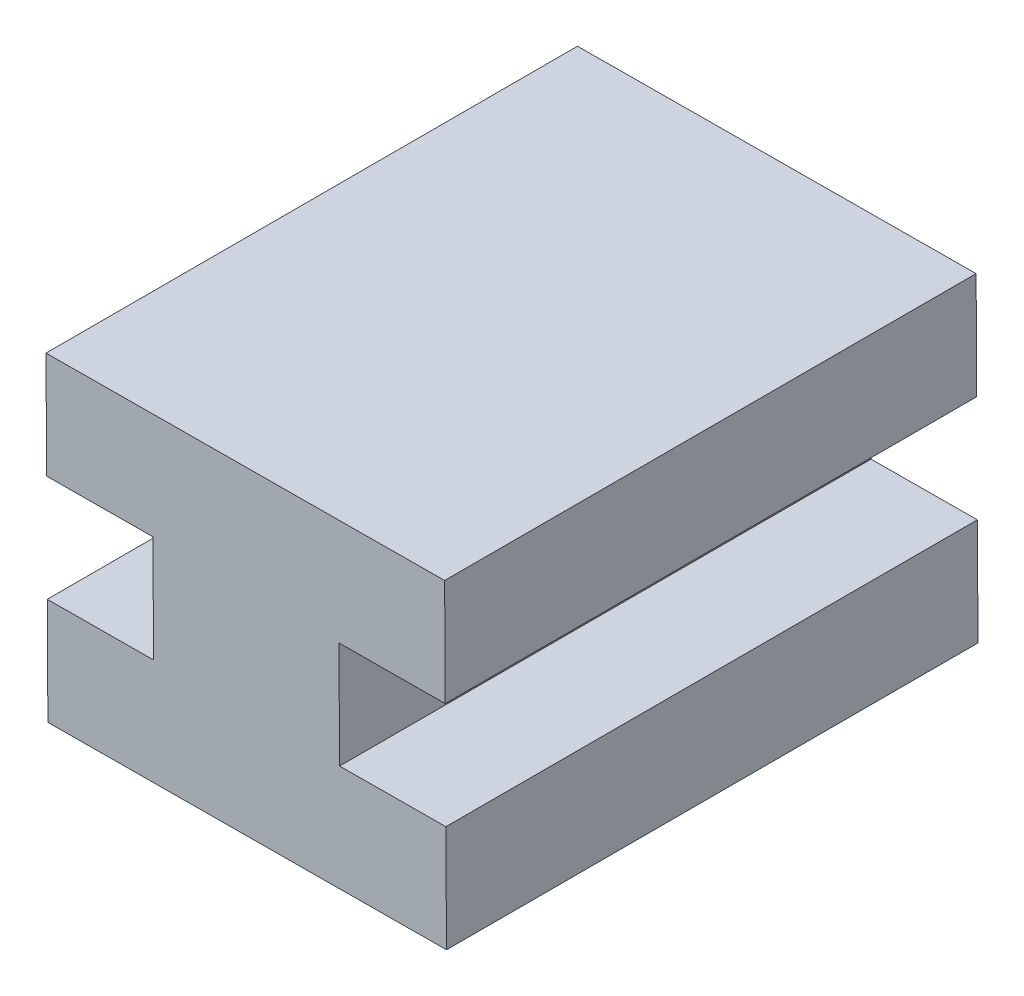
ISO-10303-21;
HEADER;
FILE_DESCRIPTION(('STEP AP214'),'2;1');
FILE_NAME('part.step','',(''),(''),'','','');
FILE_SCHEMA(('AUTOMOTIVE_DESIGN { 1 0 10303 214 1 1 1 1 }'));
ENDSEC;
DATA;
#1=APPLICATION_CONTEXT('core data for automotive mechanical design processes');
#2=APPLICATION_PROTOCOL_DEFINITION('international standard','automotive_design',2000,#1);
#3=PRODUCT_CONTEXT('',#1,'mechanical');
#4=PRODUCT('Part','Part','',(#3));
#5=PRODUCT_RELATED_PRODUCT_CATEGORY('part','',(#4));
#6=PRODUCT_DEFINITION_FORMATION('','',#4);
#7=PRODUCT_DEFINITION_CONTEXT('part definition',#1,'design');
#8=PRODUCT_DEFINITION('design','',#6,#7);
#9=PRODUCT_DEFINITION_SHAPE('','',#8);
#10=(LENGTH_UNIT() NAMED_UNIT(*) SI_UNIT(.MILLI.,.METRE.));
#11=(NAMED_UNIT(*) PLANE_ANGLE_UNIT() SI_UNIT($,.RADIAN.));
#12=(NAMED_UNIT(*) SI_UNIT($,.STERADIAN.) SOLID_ANGLE_UNIT());
#13=UNCERTAINTY_MEASURE_WITH_UNIT(LENGTH_MEASURE(1.E-05),#10,'distance_accuracy_value','');
#14=(GEOMETRIC_REPRESENTATION_CONTEXT(3) GLOBAL_UNCERTAINTY_ASSIGNED_CONTEXT((#13)) GLOBAL_UNIT_ASSIGNED_CONTEXT((#10,
#11,#12)) REPRESENTATION_CONTEXT('',''));
#15=CARTESIAN_POINT('',(0.,0.,0.));
#16=DIRECTION('',(0.,0.,1.));
#17=DIRECTION('',(1.,0.,0.));
#18=AXIS2_PLACEMENT_3D('',#15,#16,#17);
#19=CARTESIAN_POINT('',(7.25087420634283,129.455799301792,-10.));
#20=DIRECTION('',(-0.999982523573569,-0.00591206794918995,0.));
#21=DIRECTION('',(0.00591206794918995,-0.999982523573569,0.));
#22=AXIS2_PLACEMENT_3D('',#19,#20,#21);
#23=PLANE('',#22);
#24=DIRECTION('',(0.,0.,1.));
#25=VECTOR('',#24,1.);
#26=CARTESIAN_POINT('',(7.27452247813959,125.455869207498,-10.));
#27=LINE('',#26,#25);
#28=CARTESIAN_POINT('',(7.27452247813959,125.455869207498,-10.));
#29=VERTEX_POINT('',#28);
#30=CARTESIAN_POINT('',(7.27452247813959,125.455869207498,10.));
#31=VERTEX_POINT('',#30);
#32=EDGE_CURVE('E35',#29,#31,#27,.T.);
#33=ORIENTED_EDGE('',*,*,#32,.T.);
#34=DIRECTION('',(0.00591206794918995,-0.999982523573569,0.));
#35=VECTOR('',#34,1.);
#36=CARTESIAN_POINT('',(7.25087420634283,129.455799301792,10.));
#37=LINE('',#36,#35);
#38=CARTESIAN_POINT('',(7.25087420634283,129.455799301792,10.));
#39=VERTEX_POINT('',#38);
#40=EDGE_CURVE('E120',#39,#31,#37,.T.);
#41=ORIENTED_EDGE('',*,*,#40,.F.);
#42=DIRECTION('',(0.,0.,1.));
#43=VECTOR('',#42,1.);
#44=CARTESIAN_POINT('',(7.25087420634283,129.455799301792,-10.));
#45=LINE('',#44,#43);
#46=CARTESIAN_POINT('',(7.25087420634283,129.455799301792,-10.));
#47=VERTEX_POINT('',#46);
#48=EDGE_CURVE('E11',#47,#39,#45,.T.);
#49=ORIENTED_EDGE('',*,*,#48,.F.);
#50=DIRECTION('',(0.00591206794918995,-0.999982523573569,0.));
#51=VECTOR('',#50,1.);
#52=CARTESIAN_POINT('',(7.25087420634283,129.455799301792,-10.));
#53=LINE('',#52,#51);
#54=EDGE_CURVE('E121',#47,#29,#53,.T.);
#55=ORIENTED_EDGE('',*,*,#54,.T.);
#56=EDGE_LOOP('',(#33,#41,#49,#55));
#57=FACE_BOUND('',#56,.T.);
#58=ADVANCED_FACE('F32',(#57),#23,.T.);
#59=CARTESIAN_POINT('',(11.2508043006371,129.479447573589,-10.));
#60=DIRECTION('',(-0.00591206794919863,0.999982523573569,0.));
#61=DIRECTION('',(-0.999982523573569,-0.00591206794919863,0.));
#62=AXIS2_PLACEMENT_3D('',#59,#60,#61);
#63=PLANE('',#62);
#64=ORIENTED_EDGE('',*,*,#48,.T.);
#65=DIRECTION('',(-0.999982523573569,-0.00591206794919863,0.));
#66=VECTOR('',#65,1.);
#67=CARTESIAN_POINT('',(11.2508043006371,129.479447573589,10.));
#68=LINE('',#67,#66);
#69=CARTESIAN_POINT('',(11.2508043006371,129.479447573589,10.));
#70=VERTEX_POINT('',#69);
#71=EDGE_CURVE('E138',#70,#39,#68,.T.);
#72=ORIENTED_EDGE('',*,*,#71,.F.);
#73=DIRECTION('',(0.,0.,1.));
#74=VECTOR('',#73,1.);
#75=CARTESIAN_POINT('',(11.2508043006371,129.479447573589,-10.));
#76=LINE('',#75,#74);
#77=CARTESIAN_POINT('',(11.2508043006371,129.479447573589,-10.));
#78=VERTEX_POINT('',#77);
#79=EDGE_CURVE('E40',#78,#70,#76,.T.);
#80=ORIENTED_EDGE('',*,*,#79,.F.);
#81=DIRECTION('',(-0.999982523573569,-0.00591206794919863,0.));
#82=VECTOR('',#81,1.);
#83=CARTESIAN_POINT('',(11.2508043006371,129.479447573589,-10.));
#84=LINE('',#83,#82);
#85=EDGE_CURVE('E126',#78,#47,#84,.T.);
#86=ORIENTED_EDGE('',*,*,#85,.T.);
#87=EDGE_LOOP('',(#64,#72,#80,#86));
#88=FACE_BOUND('',#87,.T.);
#89=ADVANCED_FACE('F250',(#88),#63,.T.);
#90=CARTESIAN_POINT('',(11.2271560288403,133.479377667884,-10.));
#91=DIRECTION('',(-0.999982523573569,-0.00591206794919429,0.));
#92=DIRECTION('',(0.00591206794919429,-0.999982523573569,0.));
#93=AXIS2_PLACEMENT_3D('',#90,#91,#92);
#94=PLANE('',#93);
#95=ORIENTED_EDGE('',*,*,#79,.T.);
#96=DIRECTION('',(0.00591206794919429,-0.999982523573569,0.));
#97=VECTOR('',#96,1.);
#98=CARTESIAN_POINT('',(11.2271560288403,133.479377667884,10.));
#99=LINE('',#98,#97);
#100=CARTESIAN_POINT('',(11.2271560288403,133.479377667884,10.));
#101=VERTEX_POINT('',#100);
#102=EDGE_CURVE('E163',#101,#70,#99,.T.);
#103=ORIENTED_EDGE('',*,*,#102,.F.);
#104=DIRECTION('',(0.,0.,1.));
#105=VECTOR('',#104,1.);
#106=CARTESIAN_POINT('',(11.2271560288403,133.479377667884,-10.));
#107=LINE('',#106,#105);
#108=CARTESIAN_POINT('',(11.2271560288403,133.479377667884,-10.));
#109=VERTEX_POINT('',#108);
#110=EDGE_CURVE('E197',#109,#101,#107,.T.);
#111=ORIENTED_EDGE('',*,*,#110,.F.);
#112=DIRECTION('',(0.00591206794919429,-0.999982523573569,0.));
#113=VECTOR('',#112,1.);
#114=CARTESIAN_POINT('',(11.2271560288403,133.479377667884,-10.));
#115=LINE('',#114,#113);
#116=EDGE_CURVE('E193',#109,#78,#115,.T.);
#117=ORIENTED_EDGE('',*,*,#116,.T.);
#118=EDGE_LOOP('',(#95,#103,#111,#117));
#119=FACE_BOUND('',#118,.T.);
#120=ADVANCED_FACE('F248',(#119),#94,.T.);
#121=CARTESIAN_POINT('',(7.22722593454606,133.455729396087,-10.));
#122=DIRECTION('',(0.00591206794919863,-0.999982523573569,0.));
#123=DIRECTION('',(0.999982523573569,0.00591206794919863,0.));
#124=AXIS2_PLACEMENT_3D('',#121,#122,#123);
#125=PLANE('',#124);
#126=ORIENTED_EDGE('',*,*,#110,.T.);
#127=DIRECTION('',(0.999982523573569,0.00591206794919863,0.));
#128=VECTOR('',#127,1.);
#129=CARTESIAN_POINT('',(7.22722593454606,133.455729396087,10.));
#130=LINE('',#129,#128);
#131=CARTESIAN_POINT('',(7.22722593454606,133.455729396087,10.));
#132=VERTEX_POINT('',#131);
#133=EDGE_CURVE('E160',#132,#101,#130,.T.);
#134=ORIENTED_EDGE('',*,*,#133,.F.);
#135=DIRECTION('',(0.,0.,1.));
#136=VECTOR('',#135,1.);
#137=CARTESIAN_POINT('',(7.22722593454606,133.455729396087,-10.));
#138=LINE('',#137,#136);
#139=CARTESIAN_POINT('',(7.22722593454606,133.455729396087,-10.));
#140=VERTEX_POINT('',#139);
#141=EDGE_CURVE('E199',#140,#132,#138,.T.);
#142=ORIENTED_EDGE('',*,*,#141,.F.);
#143=DIRECTION('',(0.999982523573569,0.00591206794919863,0.));
#144=VECTOR('',#143,1.);
#145=CARTESIAN_POINT('',(7.22722593454606,133.455729396087,-10.));
#146=LINE('',#145,#144);
#147=EDGE_CURVE('E190',#140,#109,#146,.T.);
#148=ORIENTED_EDGE('',*,*,#147,.T.);
#149=EDGE_LOOP('',(#126,#134,#142,#148));
#150=FACE_BOUND('',#149,.T.);
#151=ADVANCED_FACE('F246',(#150),#125,.T.);
#152=CARTESIAN_POINT('',(7.20357766274929,137.455659490381,-10.));
#153=DIRECTION('',(-0.999982523573569,-0.00591206794919255,0.));
#154=DIRECTION('',(0.00591206794919255,-0.999982523573569,0.));
#155=AXIS2_PLACEMENT_3D('',#152,#153,#154);
#156=PLANE('',#155);
#157=ORIENTED_EDGE('',*,*,#141,.T.);
#158=DIRECTION('',(0.00591206794919256,-0.999982523573569,0.));
#159=VECTOR('',#158,1.);
#160=CARTESIAN_POINT('',(7.20357766274929,137.455659490381,10.));
#161=LINE('',#160,#159);
#162=CARTESIAN_POINT('',(7.20357766274929,137.455659490381,10.));
#163=VERTEX_POINT('',#162);
#164=EDGE_CURVE('E157',#163,#132,#161,.T.);
#165=ORIENTED_EDGE('',*,*,#164,.F.);
#166=DIRECTION('',(0.,0.,1.));
#167=VECTOR('',#166,1.);
#168=CARTESIAN_POINT('',(7.20357766274929,137.455659490381,-10.));
#169=LINE('',#168,#167);
#170=CARTESIAN_POINT('',(7.20357766274929,137.455659490381,-10.));
#171=VERTEX_POINT('',#170);
#172=EDGE_CURVE('E201',#171,#163,#169,.T.);
#173=ORIENTED_EDGE('',*,*,#172,.F.);
#174=DIRECTION('',(0.00591206794919256,-0.999982523573569,0.));
#175=VECTOR('',#174,1.);
#176=CARTESIAN_POINT('',(7.20357766274929,137.455659490381,-10.));
#177=LINE('',#176,#175);
#178=EDGE_CURVE('E187',#171,#140,#177,.T.);
#179=ORIENTED_EDGE('',*,*,#178,.T.);
#180=EDGE_LOOP('',(#157,#165,#173,#179));
#181=FACE_BOUND('',#180,.T.);
#182=ADVANCED_FACE('F241',(#181),#156,.T.);
#183=CARTESIAN_POINT('',(22.2033155163528,137.544340509619,-10.));
#184=DIRECTION('',(-0.00591206794919308,0.999982523573569,0.));
#185=DIRECTION('',(-0.999982523573569,-0.00591206794919308,0.));
#186=AXIS2_PLACEMENT_3D('',#183,#184,#185);
#187=PLANE('',#186);
#188=ORIENTED_EDGE('',*,*,#172,.T.);
#189=DIRECTION('',(-0.999982523573569,-0.00591206794919308,0.));
#190=VECTOR('',#189,1.);
#191=CARTESIAN_POINT('',(22.2033155163528,137.544340509619,10.));
#192=LINE('',#191,#190);
#193=CARTESIAN_POINT('',(22.2033155163528,137.544340509619,10.));
#194=VERTEX_POINT('',#193);
#195=EDGE_CURVE('E154',#194,#163,#192,.T.);
#196=ORIENTED_EDGE('',*,*,#195,.F.);
#197=DIRECTION('',(0.,0.,1.));
#198=VECTOR('',#197,1.);
#199=CARTESIAN_POINT('',(22.2033155163528,137.544340509619,-10.));
#200=LINE('',#199,#198);
#201=CARTESIAN_POINT('',(22.2033155163528,137.544340509619,-10.));
#202=VERTEX_POINT('',#201);
#203=EDGE_CURVE('E203',#202,#194,#200,.T.);
#204=ORIENTED_EDGE('',*,*,#203,.F.);
#205=DIRECTION('',(-0.999982523573569,-0.00591206794919308,0.));
#206=VECTOR('',#205,1.);
#207=CARTESIAN_POINT('',(22.2033155163528,137.544340509619,-10.));
#208=LINE('',#207,#206);
#209=EDGE_CURVE('E184',#202,#171,#208,.T.);
#210=ORIENTED_EDGE('',*,*,#209,.T.);
#211=EDGE_LOOP('',(#188,#196,#204,#210));
#212=FACE_BOUND('',#211,.T.);
#213=ADVANCED_FACE('F236',(#212),#187,.T.);
#214=CARTESIAN_POINT('',(22.2269637881496,133.544410415325,-10.));
#215=DIRECTION('',(0.999982523573569,0.00591206794919169,0.));
#216=DIRECTION('',(-0.00591206794919169,0.999982523573569,0.));
#217=AXIS2_PLACEMENT_3D('',#214,#215,#216);
#218=PLANE('',#217);
#219=ORIENTED_EDGE('',*,*,#203,.T.);
#220=DIRECTION('',(-0.00591206794919169,0.999982523573569,0.));
#221=VECTOR('',#220,1.);
#222=CARTESIAN_POINT('',(22.2269637881496,133.544410415325,10.));
#223=LINE('',#222,#221);
#224=CARTESIAN_POINT('',(22.2269637881496,133.544410415325,10.));
#225=VERTEX_POINT('',#224);
#226=EDGE_CURVE('E151',#225,#194,#223,.T.);
#227=ORIENTED_EDGE('',*,*,#226,.F.);
#228=DIRECTION('',(0.,0.,1.));
#229=VECTOR('',#228,1.);
#230=CARTESIAN_POINT('',(22.2269637881496,133.544410415325,-10.));
#231=LINE('',#230,#229);
#232=CARTESIAN_POINT('',(22.2269637881496,133.544410415325,-10.));
#233=VERTEX_POINT('',#232);
#234=EDGE_CURVE('E205',#233,#225,#231,.T.);
#235=ORIENTED_EDGE('',*,*,#234,.F.);
#236=DIRECTION('',(-0.00591206794919169,0.999982523573569,0.));
#237=VECTOR('',#236,1.);
#238=CARTESIAN_POINT('',(22.2269637881496,133.544410415325,-10.));
#239=LINE('',#238,#237);
#240=EDGE_CURVE('E181',#233,#202,#239,.T.);
#241=ORIENTED_EDGE('',*,*,#240,.T.);
#242=EDGE_LOOP('',(#219,#227,#235,#241));
#243=FACE_BOUND('',#242,.T.);
#244=ADVANCED_FACE('F234',(#243),#218,.T.);
#245=CARTESIAN_POINT('',(18.2270336938553,133.520762143528,-10.));
#246=DIRECTION('',(0.00591206794919169,-0.999982523573569,0.));
#247=DIRECTION('',(0.999982523573569,0.00591206794919169,0.));
#248=AXIS2_PLACEMENT_3D('',#245,#246,#247);
#249=PLANE('',#248);
#250=ORIENTED_EDGE('',*,*,#234,.T.);
#251=DIRECTION('',(0.999982523573569,0.00591206794919169,0.));
#252=VECTOR('',#251,1.);
#253=CARTESIAN_POINT('',(18.2270336938553,133.520762143528,10.));
#254=LINE('',#253,#252);
#255=CARTESIAN_POINT('',(18.2270336938553,133.520762143528,10.));
#256=VERTEX_POINT('',#255);
#257=EDGE_CURVE('E148',#256,#225,#254,.T.);
#258=ORIENTED_EDGE('',*,*,#257,.F.);
#259=DIRECTION('',(0.,0.,1.));
#260=VECTOR('',#259,1.);
#261=CARTESIAN_POINT('',(18.2270336938553,133.520762143528,-10.));
#262=LINE('',#261,#260);
#263=CARTESIAN_POINT('',(18.2270336938553,133.520762143528,-10.));
#264=VERTEX_POINT('',#263);
#265=EDGE_CURVE('E207',#264,#256,#262,.T.);
#266=ORIENTED_EDGE('',*,*,#265,.F.);
#267=DIRECTION('',(0.999982523573569,0.00591206794919169,0.));
#268=VECTOR('',#267,1.);
#269=CARTESIAN_POINT('',(18.2270336938553,133.520762143528,-10.));
#270=LINE('',#269,#268);
#271=EDGE_CURVE('E178',#264,#233,#270,.T.);
#272=ORIENTED_EDGE('',*,*,#271,.T.);
#273=EDGE_LOOP('',(#250,#258,#266,#272));
#274=FACE_BOUND('',#273,.T.);
#275=ADVANCED_FACE('F229',(#274),#249,.T.);
#276=CARTESIAN_POINT('',(18.2506819656521,129.520832049234,-10.));
#277=DIRECTION('',(0.999982523573569,0.00591206794919169,0.));
#278=DIRECTION('',(-0.00591206794919169,0.999982523573569,0.));
#279=AXIS2_PLACEMENT_3D('',#276,#277,#278);
#280=PLANE('',#279);
#281=ORIENTED_EDGE('',*,*,#265,.T.);
#282=DIRECTION('',(-0.00591206794919169,0.999982523573569,0.));
#283=VECTOR('',#282,1.);
#284=CARTESIAN_POINT('',(18.2506819656521,129.520832049234,10.));
#285=LINE('',#284,#283);
#286=CARTESIAN_POINT('',(18.2506819656521,129.520832049234,10.));
#287=VERTEX_POINT('',#286);
#288=EDGE_CURVE('E145',#287,#256,#285,.T.);
#289=ORIENTED_EDGE('',*,*,#288,.F.);
#290=DIRECTION('',(0.,0.,1.));
#291=VECTOR('',#290,1.);
#292=CARTESIAN_POINT('',(18.2506819656521,129.520832049234,-10.));
#293=LINE('',#292,#291);
#294=CARTESIAN_POINT('',(18.2506819656521,129.520832049234,-10.));
#295=VERTEX_POINT('',#294);
#296=EDGE_CURVE('E209',#295,#287,#293,.T.);
#297=ORIENTED_EDGE('',*,*,#296,.F.);
#298=DIRECTION('',(-0.00591206794919169,0.999982523573569,0.));
#299=VECTOR('',#298,1.);
#300=CARTESIAN_POINT('',(18.2506819656521,129.520832049234,-10.));
#301=LINE('',#300,#299);
#302=EDGE_CURVE('E175',#295,#264,#301,.T.);
#303=ORIENTED_EDGE('',*,*,#302,.T.);
#304=EDGE_LOOP('',(#281,#289,#297,#303));
#305=FACE_BOUND('',#304,.T.);
#306=ADVANCED_FACE('F222',(#305),#280,.T.);
#307=CARTESIAN_POINT('',(22.2506120599464,129.54448032103,-10.));
#308=DIRECTION('',(-0.00591206794919169,0.999982523573569,0.));
#309=DIRECTION('',(-0.999982523573569,-0.00591206794919169,0.));
#310=AXIS2_PLACEMENT_3D('',#307,#308,#309);
#311=PLANE('',#310);
#312=ORIENTED_EDGE('',*,*,#296,.T.);
#313=DIRECTION('',(-0.999982523573569,-0.00591206794919169,0.));
#314=VECTOR('',#313,1.);
#315=CARTESIAN_POINT('',(22.2506120599464,129.54448032103,10.));
#316=LINE('',#315,#314);
#317=CARTESIAN_POINT('',(22.2506120599464,129.54448032103,10.));
#318=VERTEX_POINT('',#317);
#319=EDGE_CURVE('E142',#318,#287,#316,.T.);
#320=ORIENTED_EDGE('',*,*,#319,.F.);
#321=DIRECTION('',(0.,0.,1.));
#322=VECTOR('',#321,1.);
#323=CARTESIAN_POINT('',(22.2506120599464,129.54448032103,-10.));
#324=LINE('',#323,#322);
#325=CARTESIAN_POINT('',(22.2506120599464,129.54448032103,-10.));
#326=VERTEX_POINT('',#325);
#327=EDGE_CURVE('E211',#326,#318,#324,.T.);
#328=ORIENTED_EDGE('',*,*,#327,.F.);
#329=DIRECTION('',(-0.999982523573569,-0.00591206794919169,0.));
#330=VECTOR('',#329,1.);
#331=CARTESIAN_POINT('',(22.2506120599464,129.54448032103,-10.));
#332=LINE('',#331,#330);
#333=EDGE_CURVE('E172',#326,#295,#332,.T.);
#334=ORIENTED_EDGE('',*,*,#333,.T.);
#335=EDGE_LOOP('',(#312,#320,#328,#334));
#336=FACE_BOUND('',#335,.T.);
#337=ADVANCED_FACE('F219',(#336),#311,.T.);
#338=CARTESIAN_POINT('',(22.2742603317431,125.544550226736,-10.));
#339=DIRECTION('',(0.999982523573569,0.00591206794919429,0.));
#340=DIRECTION('',(-0.00591206794919429,0.999982523573569,0.));
#341=AXIS2_PLACEMENT_3D('',#338,#339,#340);
#342=PLANE('',#341);
#343=ORIENTED_EDGE('',*,*,#327,.T.);
#344=DIRECTION('',(-0.00591206794919429,0.999982523573569,0.));
#345=VECTOR('',#344,1.);
#346=CARTESIAN_POINT('',(22.2742603317431,125.544550226736,10.));
#347=LINE('',#346,#345);
#348=CARTESIAN_POINT('',(22.2742603317431,125.544550226736,10.));
#349=VERTEX_POINT('',#348);
#350=EDGE_CURVE('E133',#349,#318,#347,.T.);
#351=ORIENTED_EDGE('',*,*,#350,.F.);
#352=DIRECTION('',(0.,0.,1.));
#353=VECTOR('',#352,1.);
#354=CARTESIAN_POINT('',(22.2742603317431,125.544550226736,-10.));
#355=LINE('',#354,#353);
#356=CARTESIAN_POINT('',(22.2742603317431,125.544550226736,-10.));
#357=VERTEX_POINT('',#356);
#358=EDGE_CURVE('E125',#357,#349,#355,.T.);
#359=ORIENTED_EDGE('',*,*,#358,.F.);
#360=DIRECTION('',(-0.00591206794919429,0.999982523573569,0.));
#361=VECTOR('',#360,1.);
#362=CARTESIAN_POINT('',(22.2742603317431,125.544550226736,-10.));
#363=LINE('',#362,#361);
#364=EDGE_CURVE('E169',#357,#326,#363,.T.);
#365=ORIENTED_EDGE('',*,*,#364,.T.);
#366=EDGE_LOOP('',(#343,#351,#359,#365));
#367=FACE_BOUND('',#366,.T.);
#368=ADVANCED_FACE('F213',(#367),#342,.T.);
#369=CARTESIAN_POINT('',(7.27452247813959,125.455869207498,-10.));
#370=DIRECTION('',(0.00591206794919308,-0.999982523573569,0.));
#371=DIRECTION('',(0.999982523573569,0.00591206794919308,0.));
#372=AXIS2_PLACEMENT_3D('',#369,#370,#371);
#373=PLANE('',#372);
#374=ORIENTED_EDGE('',*,*,#358,.T.);
#375=DIRECTION('',(0.999982523573569,0.00591206794919308,0.));
#376=VECTOR('',#375,1.);
#377=CARTESIAN_POINT('',(7.27452247813959,125.455869207498,10.));
#378=LINE('',#377,#376);
#379=EDGE_CURVE('E128',#31,#349,#378,.T.);
#380=ORIENTED_EDGE('',*,*,#379,.F.);
#381=ORIENTED_EDGE('',*,*,#32,.F.);
#382=DIRECTION('',(0.999982523573569,0.00591206794919308,0.));
#383=VECTOR('',#382,1.);
#384=CARTESIAN_POINT('',(7.27452247813959,125.455869207498,-10.));
#385=LINE('',#384,#383);
#386=EDGE_CURVE('E167',#29,#357,#385,.T.);
#387=ORIENTED_EDGE('',*,*,#386,.T.);
#388=EDGE_LOOP('',(#374,#380,#381,#387));
#389=FACE_BOUND('',#388,.T.);
#390=ADVANCED_FACE('F129',(#389),#373,.T.);
#391=CARTESIAN_POINT('',(0.,0.,-10.));
#392=DIRECTION('',(0.,0.,1.));
#393=DIRECTION('',(1.,0.,0.));
#394=AXIS2_PLACEMENT_3D('',#391,#392,#393);
#395=PLANE('',#394);
#396=ORIENTED_EDGE('',*,*,#54,.F.);
#397=ORIENTED_EDGE('',*,*,#85,.F.);
#398=ORIENTED_EDGE('',*,*,#116,.F.);
#399=ORIENTED_EDGE('',*,*,#147,.F.);
#400=ORIENTED_EDGE('',*,*,#178,.F.);
#401=ORIENTED_EDGE('',*,*,#209,.F.);
#402=ORIENTED_EDGE('',*,*,#240,.F.);
#403=ORIENTED_EDGE('',*,*,#271,.F.);
#404=ORIENTED_EDGE('',*,*,#302,.F.);
#405=ORIENTED_EDGE('',*,*,#333,.F.);
#406=ORIENTED_EDGE('',*,*,#364,.F.);
#407=ORIENTED_EDGE('',*,*,#386,.F.);
#408=EDGE_LOOP('',(#396,#397,#398,#399,#400,#401,#402,#403,#404,#405,#406,#407));
#409=FACE_BOUND('',#408,.T.);
#410=ADVANCED_FACE('F225',(#409),#395,.F.);
#411=CARTESIAN_POINT('',(0.,0.,10.));
#412=DIRECTION('',(0.,0.,1.));
#413=DIRECTION('',(1.,0.,0.));
#414=AXIS2_PLACEMENT_3D('',#411,#412,#413);
#415=PLANE('',#414);
#416=ORIENTED_EDGE('',*,*,#40,.T.);
#417=ORIENTED_EDGE('',*,*,#379,.T.);
#418=ORIENTED_EDGE('',*,*,#350,.T.);
#419=ORIENTED_EDGE('',*,*,#319,.T.);
#420=ORIENTED_EDGE('',*,*,#288,.T.);
#421=ORIENTED_EDGE('',*,*,#257,.T.);
#422=ORIENTED_EDGE('',*,*,#226,.T.);
#423=ORIENTED_EDGE('',*,*,#195,.T.);
#424=ORIENTED_EDGE('',*,*,#164,.T.);
#425=ORIENTED_EDGE('',*,*,#133,.T.);
#426=ORIENTED_EDGE('',*,*,#102,.T.);
#427=ORIENTED_EDGE('',*,*,#71,.T.);
#428=EDGE_LOOP('',(#416,#417,#418,#419,#420,#421,#422,#423,#424,#425,#426,#427));
#429=FACE_BOUND('',#428,.T.);
#430=ADVANCED_FACE('F136',(#429),#415,.T.);
#431=CLOSED_SHELL('',(#58,#89,#120,#151,#182,#213,#244,#275,#306,#337,#368,#390,#410,#430));
#432=MANIFOLD_SOLID_BREP('B2',#431);
#433=ADVANCED_BREP_SHAPE_REPRESENTATION('',(#18,#432),#14);
#434=SHAPE_DEFINITION_REPRESENTATION(#9,#433);
ENDSEC;
END-ISO-10303-21;
